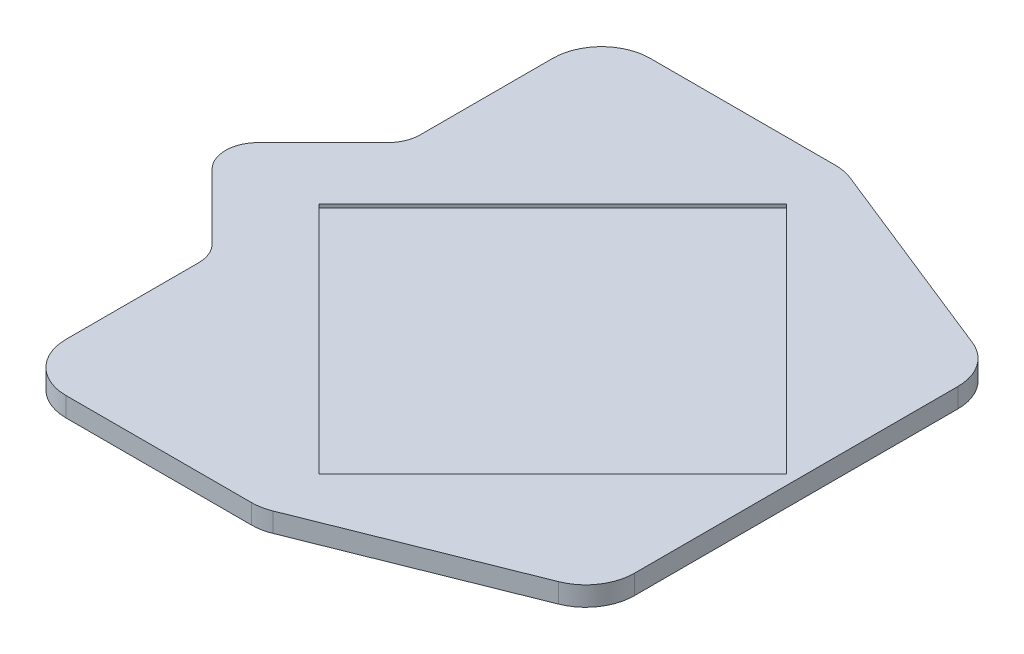
ISO-10303-21;
HEADER;
FILE_DESCRIPTION(('STEP AP214'),'2;1');
FILE_NAME('part.step','',(''),(''),'','','');
FILE_SCHEMA(('AUTOMOTIVE_DESIGN { 1 0 10303 214 1 1 1 1 }'));
ENDSEC;
DATA;
#1=APPLICATION_CONTEXT('core data for automotive mechanical design processes');
#2=APPLICATION_PROTOCOL_DEFINITION('international standard','automotive_design',2000,#1);
#3=PRODUCT_CONTEXT('',#1,'mechanical');
#4=PRODUCT('Part','Part','',(#3));
#5=PRODUCT_RELATED_PRODUCT_CATEGORY('part','',(#4));
#6=PRODUCT_DEFINITION_FORMATION('','',#4);
#7=PRODUCT_DEFINITION_CONTEXT('part definition',#1,'design');
#8=PRODUCT_DEFINITION('design','',#6,#7);
#9=PRODUCT_DEFINITION_SHAPE('','',#8);
#10=(LENGTH_UNIT() NAMED_UNIT(*) SI_UNIT(.MILLI.,.METRE.));
#11=(NAMED_UNIT(*) PLANE_ANGLE_UNIT() SI_UNIT($,.RADIAN.));
#12=(NAMED_UNIT(*) SI_UNIT($,.STERADIAN.) SOLID_ANGLE_UNIT());
#13=UNCERTAINTY_MEASURE_WITH_UNIT(LENGTH_MEASURE(1.E-05),#10,'distance_accuracy_value','');
#14=(GEOMETRIC_REPRESENTATION_CONTEXT(3) GLOBAL_UNCERTAINTY_ASSIGNED_CONTEXT((#13)) GLOBAL_UNIT_ASSIGNED_CONTEXT((#10,
#11,#12)) REPRESENTATION_CONTEXT('',''));
#15=CARTESIAN_POINT('',(0.,0.,0.));
#16=DIRECTION('',(0.,0.,1.));
#17=DIRECTION('',(1.,0.,0.));
#18=AXIS2_PLACEMENT_3D('',#15,#16,#17);
#19=CARTESIAN_POINT('',(3.74561403508772,1.1,3.));
#20=DIRECTION('',(-0.707106781186548,0.,-0.707106781186547));
#21=DIRECTION('',(-0.707106781186547,0.,0.707106781186548));
#22=AXIS2_PLACEMENT_3D('',#19,#20,#21);
#23=PLANE('',#22);
#24=DIRECTION('',(0.707106781186547,0.,-0.707106781186548));
#25=VECTOR('',#24,1.);
#26=CARTESIAN_POINT('',(3.74561403508772,1.1,3.));
#27=LINE('',#26,#25);
#28=CARTESIAN_POINT('',(-6.84017240253918,1.1,13.5857864376269));
#29=VERTEX_POINT('',#28);
#30=CARTESIAN_POINT('',(-2.84017240253919,1.1,9.58578643762691));
#31=VERTEX_POINT('',#30);
#32=EDGE_CURVE('E223',#29,#31,#27,.T.);
#33=ORIENTED_EDGE('',*,*,#32,.T.);
#34=DIRECTION('',(0.,-1.,0.));
#35=VECTOR('',#34,1.);
#36=CARTESIAN_POINT('',(-2.84017240253919,1.1,9.58578643762691));
#37=LINE('',#36,#35);
#38=CARTESIAN_POINT('',(-2.84017240253919,-0.1,9.58578643762691));
#39=VERTEX_POINT('',#38);
#40=EDGE_CURVE('E338',#31,#39,#37,.T.);
#41=ORIENTED_EDGE('',*,*,#40,.T.);
#42=DIRECTION('',(0.707106781186547,0.,-0.707106781186548));
#43=VECTOR('',#42,1.);
#44=CARTESIAN_POINT('',(3.74561403508772,-0.1,3.));
#45=LINE('',#44,#43);
#46=CARTESIAN_POINT('',(-6.84017240253918,-0.1,13.5857864376269));
#47=VERTEX_POINT('',#46);
#48=EDGE_CURVE('E219',#47,#39,#45,.T.);
#49=ORIENTED_EDGE('',*,*,#48,.F.);
#50=DIRECTION('',(0.,-1.,0.));
#51=VECTOR('',#50,1.);
#52=CARTESIAN_POINT('',(-6.84017240253918,1.1,13.5857864376269));
#53=LINE('',#52,#51);
#54=EDGE_CURVE('E272',#47,#29,#53,.F.);
#55=ORIENTED_EDGE('',*,*,#54,.T.);
#56=EDGE_LOOP('',(#33,#41,#49,#55));
#57=FACE_BOUND('',#56,.T.);
#58=ADVANCED_FACE('F36',(#57),#23,.T.);
#59=CARTESIAN_POINT('',(-14.2543859649123,1.1,9.));
#60=DIRECTION('',(-0.707106781186547,0.,0.707106781186547));
#61=DIRECTION('',(0.707106781186548,0.,0.707106781186548));
#62=AXIS2_PLACEMENT_3D('',#59,#60,#61);
#63=PLANE('',#62);
#64=DIRECTION('',(-0.707106781186548,0.,-0.707106781186548));
#65=VECTOR('',#64,1.);
#66=CARTESIAN_POINT('',(-14.2543859649123,-0.1,9.));
#67=LINE('',#66,#65);
#68=CARTESIAN_POINT('',(-2.84017240253918,-0.1,20.4142135623731));
#69=VERTEX_POINT('',#68);
#70=CARTESIAN_POINT('',(-6.84017240253918,-0.1,16.4142135623731));
#71=VERTEX_POINT('',#70);
#72=EDGE_CURVE('E248',#69,#71,#67,.T.);
#73=ORIENTED_EDGE('',*,*,#72,.F.);
#74=DIRECTION('',(0.,-1.,0.));
#75=VECTOR('',#74,1.);
#76=CARTESIAN_POINT('',(-2.84017240253919,1.1,20.4142135623731));
#77=LINE('',#76,#75);
#78=CARTESIAN_POINT('',(-2.84017240253918,1.1,20.4142135623731));
#79=VERTEX_POINT('',#78);
#80=EDGE_CURVE('E336',#69,#79,#77,.F.);
#81=ORIENTED_EDGE('',*,*,#80,.T.);
#82=DIRECTION('',(-0.707106781186548,0.,-0.707106781186548));
#83=VECTOR('',#82,1.);
#84=CARTESIAN_POINT('',(-14.2543859649123,1.1,9.));
#85=LINE('',#84,#83);
#86=CARTESIAN_POINT('',(-6.84017240253918,1.1,16.4142135623731));
#87=VERTEX_POINT('',#86);
#88=EDGE_CURVE('E226',#79,#87,#85,.T.);
#89=ORIENTED_EDGE('',*,*,#88,.T.);
#90=DIRECTION('',(0.,-1.,0.));
#91=VECTOR('',#90,1.);
#92=CARTESIAN_POINT('',(-6.84017240253918,1.1,16.4142135623731));
#93=LINE('',#92,#91);
#94=EDGE_CURVE('E267',#87,#71,#93,.T.);
#95=ORIENTED_EDGE('',*,*,#94,.T.);
#96=EDGE_LOOP('',(#73,#81,#89,#95));
#97=FACE_BOUND('',#96,.T.);
#98=ADVANCED_FACE('F364',(#97),#63,.T.);
#99=CARTESIAN_POINT('',(-2.25438596491228,1.1,-3.));
#100=DIRECTION('',(1.,0.,0.));
#101=DIRECTION('',(0.,0.,-1.));
#102=AXIS2_PLACEMENT_3D('',#99,#100,#101);
#103=PLANE('',#102);
#104=DIRECTION('',(0.,0.,1.));
#105=VECTOR('',#104,1.);
#106=CARTESIAN_POINT('',(-2.25438596491228,1.1,-3.));
#107=LINE('',#106,#105);
#108=CARTESIAN_POINT('',(-2.25438596491228,1.1,21.8284271247462));
#109=VERTEX_POINT('',#108);
#110=CARTESIAN_POINT('',(-2.25438596491228,1.1,30.));
#111=VERTEX_POINT('',#110);
#112=EDGE_CURVE('E229',#109,#111,#107,.T.);
#113=ORIENTED_EDGE('',*,*,#112,.F.);
#114=DIRECTION('',(0.,-1.,0.));
#115=VECTOR('',#114,1.);
#116=CARTESIAN_POINT('',(-2.25438596491228,1.1,21.8284271247462));
#117=LINE('',#116,#115);
#118=CARTESIAN_POINT('',(-2.25438596491228,-0.1,21.8284271247462));
#119=VERTEX_POINT('',#118);
#120=EDGE_CURVE('E333',#109,#119,#117,.T.);
#121=ORIENTED_EDGE('',*,*,#120,.T.);
#122=DIRECTION('',(0.,0.,1.));
#123=VECTOR('',#122,1.);
#124=CARTESIAN_POINT('',(-2.25438596491228,-0.1,-3.));
#125=LINE('',#124,#123);
#126=CARTESIAN_POINT('',(-2.25438596491228,-0.1,30.));
#127=VERTEX_POINT('',#126);
#128=EDGE_CURVE('E250',#119,#127,#125,.T.);
#129=ORIENTED_EDGE('',*,*,#128,.T.);
#130=DIRECTION('',(0.,-1.,0.));
#131=VECTOR('',#130,1.);
#132=CARTESIAN_POINT('',(-2.25438596491228,1.1,30.));
#133=LINE('',#132,#131);
#134=EDGE_CURVE('E312',#127,#111,#133,.F.);
#135=ORIENTED_EDGE('',*,*,#134,.T.);
#136=EDGE_LOOP('',(#113,#121,#129,#135));
#137=FACE_BOUND('',#136,.T.);
#138=ADVANCED_FACE('F355',(#137),#103,.F.);
#139=CARTESIAN_POINT('',(-2.25438596491228,1.1,33.));
#140=DIRECTION('',(0.,0.,-1.));
#141=DIRECTION('',(-1.,0.,0.));
#142=AXIS2_PLACEMENT_3D('',#139,#140,#141);
#143=PLANE('',#142);
#144=DIRECTION('',(1.,0.,0.));
#145=VECTOR('',#144,1.);
#146=CARTESIAN_POINT('',(-2.25438596491228,-0.1,33.));
#147=LINE('',#146,#145);
#148=CARTESIAN_POINT('',(0.745614035087718,-0.1,33.));
#149=VERTEX_POINT('',#148);
#150=CARTESIAN_POINT('',(12.1678668243859,-0.1,33.));
#151=VERTEX_POINT('',#150);
#152=EDGE_CURVE('E252',#149,#151,#147,.T.);
#153=ORIENTED_EDGE('',*,*,#152,.T.);
#154=DIRECTION('',(0.,-1.,0.));
#155=VECTOR('',#154,1.);
#156=CARTESIAN_POINT('',(12.1678668243859,1.1,33.));
#157=LINE('',#156,#155);
#158=CARTESIAN_POINT('',(12.1678668243859,1.1,33.));
#159=VERTEX_POINT('',#158);
#160=EDGE_CURVE('E298',#151,#159,#157,.F.);
#161=ORIENTED_EDGE('',*,*,#160,.T.);
#162=DIRECTION('',(1.,0.,0.));
#163=VECTOR('',#162,1.);
#164=CARTESIAN_POINT('',(-2.25438596491228,1.1,33.));
#165=LINE('',#164,#163);
#166=CARTESIAN_POINT('',(0.745614035087718,1.1,33.));
#167=VERTEX_POINT('',#166);
#168=EDGE_CURVE('E231',#167,#159,#165,.T.);
#169=ORIENTED_EDGE('',*,*,#168,.F.);
#170=DIRECTION('',(0.,-1.,0.));
#171=VECTOR('',#170,1.);
#172=CARTESIAN_POINT('',(0.745614035087718,1.1,33.));
#173=LINE('',#172,#171);
#174=EDGE_CURVE('E295',#167,#149,#173,.T.);
#175=ORIENTED_EDGE('',*,*,#174,.T.);
#176=EDGE_LOOP('',(#153,#161,#169,#175));
#177=FACE_BOUND('',#176,.T.);
#178=ADVANCED_FACE('F424',(#177),#143,.F.);
#179=CARTESIAN_POINT('',(12.2283726557774,1.1,33.2068965517241));
#180=DIRECTION('',(0.371390676354104,0.,0.928476690885259));
#181=DIRECTION('',(0.928476690885259,0.,-0.371390676354104));
#182=AXIS2_PLACEMENT_3D('',#179,#180,#181);
#183=PLANE('',#182);
#184=DIRECTION('',(-0.928476690885259,0.,0.371390676354104));
#185=VECTOR('',#184,1.);
#186=CARTESIAN_POINT('',(12.2283726557774,1.1,33.2068965517241));
#187=LINE('',#186,#185);
#188=CARTESIAN_POINT('',(25.85978606415,1.1,27.7543311883751));
#189=VERTEX_POINT('',#188);
#190=CARTESIAN_POINT('',(13.2820388534483,1.1,32.7854300726558));
#191=VERTEX_POINT('',#190);
#192=EDGE_CURVE('E235',#189,#191,#187,.T.);
#193=ORIENTED_EDGE('',*,*,#192,.T.);
#194=DIRECTION('',(0.,-1.,0.));
#195=VECTOR('',#194,1.);
#196=CARTESIAN_POINT('',(13.2820388534483,-0.1,32.7854300726558));
#197=LINE('',#196,#195);
#198=CARTESIAN_POINT('',(13.2820388534483,-0.1,32.7854300726558));
#199=VERTEX_POINT('',#198);
#200=EDGE_CURVE('E279',#191,#199,#197,.T.);
#201=ORIENTED_EDGE('',*,*,#200,.T.);
#202=DIRECTION('',(-0.928476690885259,0.,0.371390676354104));
#203=VECTOR('',#202,1.);
#204=CARTESIAN_POINT('',(12.2283726557774,-0.1,33.2068965517241));
#205=LINE('',#204,#203);
#206=CARTESIAN_POINT('',(25.85978606415,-0.1,27.7543311883751));
#207=VERTEX_POINT('',#206);
#208=EDGE_CURVE('E255',#207,#199,#205,.T.);
#209=ORIENTED_EDGE('',*,*,#208,.F.);
#210=DIRECTION('',(0.,-1.,0.));
#211=VECTOR('',#210,1.);
#212=CARTESIAN_POINT('',(25.85978606415,1.1,27.7543311883751));
#213=LINE('',#212,#211);
#214=EDGE_CURVE('E277',#207,#189,#213,.F.);
#215=ORIENTED_EDGE('',*,*,#214,.T.);
#216=EDGE_LOOP('',(#193,#201,#209,#215));
#217=FACE_BOUND('',#216,.T.);
#218=ADVANCED_FACE('F415',(#217),#183,.T.);
#219=CARTESIAN_POINT('',(27.7456140350877,1.1,-3.));
#220=DIRECTION('',(1.,0.,0.));
#221=DIRECTION('',(0.,0.,-1.));
#222=AXIS2_PLACEMENT_3D('',#219,#220,#221);
#223=PLANE('',#222);
#224=DIRECTION('',(0.,0.,1.));
#225=VECTOR('',#224,1.);
#226=CARTESIAN_POINT('',(27.7456140350877,1.1,-3.));
#227=LINE('',#226,#225);
#228=CARTESIAN_POINT('',(27.7456140350877,1.1,5.0310988842807));
#229=VERTEX_POINT('',#228);
#230=CARTESIAN_POINT('',(27.7456140350877,1.1,24.9689011157193));
#231=VERTEX_POINT('',#230);
#232=EDGE_CURVE('E238',#229,#231,#227,.T.);
#233=ORIENTED_EDGE('',*,*,#232,.T.);
#234=DIRECTION('',(0.,-1.,0.));
#235=VECTOR('',#234,1.);
#236=CARTESIAN_POINT('',(27.7456140350877,1.1,24.9689011157193));
#237=LINE('',#236,#235);
#238=CARTESIAN_POINT('',(27.7456140350877,-0.1,24.9689011157193));
#239=VERTEX_POINT('',#238);
#240=EDGE_CURVE('E317',#231,#239,#237,.T.);
#241=ORIENTED_EDGE('',*,*,#240,.T.);
#242=DIRECTION('',(0.,0.,1.));
#243=VECTOR('',#242,1.);
#244=CARTESIAN_POINT('',(27.7456140350877,-0.1,-3.));
#245=LINE('',#244,#243);
#246=CARTESIAN_POINT('',(27.7456140350877,-0.1,5.0310988842807));
#247=VERTEX_POINT('',#246);
#248=EDGE_CURVE('E258',#247,#239,#245,.T.);
#249=ORIENTED_EDGE('',*,*,#248,.F.);
#250=DIRECTION('',(0.,-1.,0.));
#251=VECTOR('',#250,1.);
#252=CARTESIAN_POINT('',(27.7456140350877,1.1,5.0310988842807));
#253=LINE('',#252,#251);
#254=EDGE_CURVE('E315',#247,#229,#253,.F.);
#255=ORIENTED_EDGE('',*,*,#254,.T.);
#256=EDGE_LOOP('',(#233,#241,#249,#255));
#257=FACE_BOUND('',#256,.T.);
#258=ADVANCED_FACE('F406',(#257),#223,.T.);
#259=CARTESIAN_POINT('',(-0.185420447670902,1.1,-8.17241379310345));
#260=DIRECTION('',(0.371390676354104,0.,-0.928476690885259));
#261=DIRECTION('',(-0.928476690885259,0.,-0.371390676354104));
#262=AXIS2_PLACEMENT_3D('',#259,#260,#261);
#263=PLANE('',#262);
#264=DIRECTION('',(0.928476690885259,0.,0.371390676354104));
#265=VECTOR('',#264,1.);
#266=CARTESIAN_POINT('',(-0.185420447670902,1.1,-8.17241379310345));
#267=LINE('',#266,#265);
#268=CARTESIAN_POINT('',(13.2820388534483,1.1,-2.78543007265578));
#269=VERTEX_POINT('',#268);
#270=CARTESIAN_POINT('',(25.85978606415,1.1,2.24566881162493));
#271=VERTEX_POINT('',#270);
#272=EDGE_CURVE('E241',#269,#271,#267,.T.);
#273=ORIENTED_EDGE('',*,*,#272,.T.);
#274=DIRECTION('',(0.,-1.,0.));
#275=VECTOR('',#274,1.);
#276=CARTESIAN_POINT('',(25.85978606415,1.1,2.24566881162493));
#277=LINE('',#276,#275);
#278=CARTESIAN_POINT('',(25.85978606415,-0.1,2.24566881162493));
#279=VERTEX_POINT('',#278);
#280=EDGE_CURVE('E322',#271,#279,#277,.T.);
#281=ORIENTED_EDGE('',*,*,#280,.T.);
#282=DIRECTION('',(0.928476690885259,0.,0.371390676354104));
#283=VECTOR('',#282,1.);
#284=CARTESIAN_POINT('',(-0.185420447670902,-0.1,-8.17241379310345));
#285=LINE('',#284,#283);
#286=CARTESIAN_POINT('',(13.2820388534483,-0.1,-2.78543007265578));
#287=VERTEX_POINT('',#286);
#288=EDGE_CURVE('E261',#287,#279,#285,.T.);
#289=ORIENTED_EDGE('',*,*,#288,.F.);
#290=DIRECTION('',(0.,-1.,0.));
#291=VECTOR('',#290,1.);
#292=CARTESIAN_POINT('',(13.2820388534483,1.1,-2.78543007265578));
#293=LINE('',#292,#291);
#294=EDGE_CURVE('E320',#287,#269,#293,.F.);
#295=ORIENTED_EDGE('',*,*,#294,.T.);
#296=EDGE_LOOP('',(#273,#281,#289,#295));
#297=FACE_BOUND('',#296,.T.);
#298=ADVANCED_FACE('F397',(#297),#263,.T.);
#299=CARTESIAN_POINT('',(-2.25438596491228,1.1,-3.));
#300=DIRECTION('',(0.,0.,-1.));
#301=DIRECTION('',(-1.,0.,0.));
#302=AXIS2_PLACEMENT_3D('',#299,#300,#301);
#303=PLANE('',#302);
#304=DIRECTION('',(1.,0.,0.));
#305=VECTOR('',#304,1.);
#306=CARTESIAN_POINT('',(-2.25438596491228,1.1,-3.));
#307=LINE('',#306,#305);
#308=CARTESIAN_POINT('',(0.745614035087718,1.1,-3.));
#309=VERTEX_POINT('',#308);
#310=CARTESIAN_POINT('',(12.167866824386,1.1,-3.));
#311=VERTEX_POINT('',#310);
#312=EDGE_CURVE('E244',#309,#311,#307,.T.);
#313=ORIENTED_EDGE('',*,*,#312,.T.);
#314=DIRECTION('',(0.,-1.,0.));
#315=VECTOR('',#314,1.);
#316=CARTESIAN_POINT('',(12.167866824386,1.1,-3.));
#317=LINE('',#316,#315);
#318=CARTESIAN_POINT('',(12.167866824386,-0.1,-3.));
#319=VERTEX_POINT('',#318);
#320=EDGE_CURVE('E327',#311,#319,#317,.T.);
#321=ORIENTED_EDGE('',*,*,#320,.T.);
#322=DIRECTION('',(1.,0.,0.));
#323=VECTOR('',#322,1.);
#324=CARTESIAN_POINT('',(-2.25438596491228,-0.1,-3.));
#325=LINE('',#324,#323);
#326=CARTESIAN_POINT('',(0.745614035087718,-0.1,-3.));
#327=VERTEX_POINT('',#326);
#328=EDGE_CURVE('E264',#327,#319,#325,.T.);
#329=ORIENTED_EDGE('',*,*,#328,.F.);
#330=DIRECTION('',(0.,-1.,0.));
#331=VECTOR('',#330,1.);
#332=CARTESIAN_POINT('',(0.745614035087718,1.1,-3.));
#333=LINE('',#332,#331);
#334=EDGE_CURVE('E325',#327,#309,#333,.F.);
#335=ORIENTED_EDGE('',*,*,#334,.T.);
#336=EDGE_LOOP('',(#313,#321,#329,#335));
#337=FACE_BOUND('',#336,.T.);
#338=ADVANCED_FACE('F389',(#337),#303,.T.);
#339=CARTESIAN_POINT('',(-2.25438596491228,-0.1,0.));
#340=VERTEX_POINT('',#339);
#341=CARTESIAN_POINT('',(-2.25438596491228,-0.1,8.17157287525381));
#342=VERTEX_POINT('',#341);
#343=EDGE_CURVE('E227',#340,#342,#125,.T.);
#344=ORIENTED_EDGE('',*,*,#343,.T.);
#345=DIRECTION('',(0.,-1.,0.));
#346=VECTOR('',#345,1.);
#347=CARTESIAN_POINT('',(-2.25438596491228,1.1,8.17157287525381));
#348=LINE('',#347,#346);
#349=CARTESIAN_POINT('',(-2.25438596491228,1.1,8.17157287525381));
#350=VERTEX_POINT('',#349);
#351=EDGE_CURVE('E341',#342,#350,#348,.F.);
#352=ORIENTED_EDGE('',*,*,#351,.T.);
#353=CARTESIAN_POINT('',(-2.25438596491228,1.1,0.));
#354=VERTEX_POINT('',#353);
#355=EDGE_CURVE('E232',#354,#350,#107,.T.);
#356=ORIENTED_EDGE('',*,*,#355,.F.);
#357=DIRECTION('',(0.,-1.,0.));
#358=VECTOR('',#357,1.);
#359=CARTESIAN_POINT('',(-2.25438596491228,-0.1,0.));
#360=LINE('',#359,#358);
#361=EDGE_CURVE('E330',#354,#340,#360,.T.);
#362=ORIENTED_EDGE('',*,*,#361,.T.);
#363=EDGE_LOOP('',(#344,#352,#356,#362));
#364=FACE_BOUND('',#363,.T.);
#365=ADVANCED_FACE('F380',(#364),#103,.F.);
#366=CARTESIAN_POINT('',(-2.25438596491228,1.1,-3.));
#367=DIRECTION('',(0.,1.,0.));
#368=DIRECTION('',(0.,0.,1.));
#369=AXIS2_PLACEMENT_3D('',#366,#367,#368);
#370=PLANE('',#369);
#371=DIRECTION('',(0.707106781186547,0.,-0.707106781186548));
#372=VECTOR('',#371,1.);
#373=CARTESIAN_POINT('',(12.7351893878508,1.1,29.4108362005818));
#374=LINE('',#373,#372);
#375=CARTESIAN_POINT('',(12.7351893878508,1.1,29.4108362005818));
#376=VERTEX_POINT('',#375);
#377=CARTESIAN_POINT('',(27.1460255884326,1.1,15.));
#378=VERTEX_POINT('',#377);
#379=EDGE_CURVE('E51',#376,#378,#374,.T.);
#380=ORIENTED_EDGE('',*,*,#379,.F.);
#381=DIRECTION('',(0.707106781186548,0.,0.707106781186547));
#382=VECTOR('',#381,1.);
#383=CARTESIAN_POINT('',(-1.67564681273105,1.1,15.));
#384=LINE('',#383,#382);
#385=CARTESIAN_POINT('',(-1.67564681273105,1.1,15.));
#386=VERTEX_POINT('',#385);
#387=EDGE_CURVE('E204',#386,#376,#384,.T.);
#388=ORIENTED_EDGE('',*,*,#387,.F.);
#389=DIRECTION('',(-0.707106781186547,0.,0.707106781186548));
#390=VECTOR('',#389,1.);
#391=CARTESIAN_POINT('',(12.7351893878508,1.1,0.589163799418154));
#392=LINE('',#391,#390);
#393=CARTESIAN_POINT('',(12.7351893878508,1.1,0.589163799418154));
#394=VERTEX_POINT('',#393);
#395=EDGE_CURVE('E207',#394,#386,#392,.T.);
#396=ORIENTED_EDGE('',*,*,#395,.F.);
#397=DIRECTION('',(-0.707106781186548,0.,-0.707106781186548));
#398=VECTOR('',#397,1.);
#399=CARTESIAN_POINT('',(27.1460255884326,1.1,15.));
#400=LINE('',#399,#398);
#401=EDGE_CURVE('E213',#378,#394,#400,.T.);
#402=ORIENTED_EDGE('',*,*,#401,.F.);
#403=EDGE_LOOP('',(#380,#388,#396,#402));
#404=FACE_BOUND('',#403,.T.);
#405=ORIENTED_EDGE('',*,*,#168,.T.);
#406=CARTESIAN_POINT('',(12.1678668243859,1.1,30.));
#407=DIRECTION('',(0.,1.,0.));
#408=DIRECTION('',(0.,0.,1.));
#409=AXIS2_PLACEMENT_3D('',#406,#407,#408);
#410=CIRCLE('',#409,3.);
#411=EDGE_CURVE('E310',#159,#191,#410,.T.);
#412=ORIENTED_EDGE('',*,*,#411,.T.);
#413=ORIENTED_EDGE('',*,*,#192,.F.);
#414=CARTESIAN_POINT('',(24.7456140350877,1.1,24.9689011157193));
#415=DIRECTION('',(0.,1.,0.));
#416=DIRECTION('',(0.,0.,1.));
#417=AXIS2_PLACEMENT_3D('',#414,#415,#416);
#418=CIRCLE('',#417,3.);
#419=EDGE_CURVE('E306',#189,#231,#418,.T.);
#420=ORIENTED_EDGE('',*,*,#419,.T.);
#421=ORIENTED_EDGE('',*,*,#232,.F.);
#422=CARTESIAN_POINT('',(24.7456140350877,1.1,5.0310988842807));
#423=DIRECTION('',(0.,1.,0.));
#424=DIRECTION('',(0.,0.,1.));
#425=AXIS2_PLACEMENT_3D('',#422,#423,#424);
#426=CIRCLE('',#425,3.);
#427=EDGE_CURVE('E304',#229,#271,#426,.T.);
#428=ORIENTED_EDGE('',*,*,#427,.T.);
#429=ORIENTED_EDGE('',*,*,#272,.F.);
#430=CARTESIAN_POINT('',(12.167866824386,1.1,0.));
#431=DIRECTION('',(0.,1.,0.));
#432=DIRECTION('',(0.,0.,1.));
#433=AXIS2_PLACEMENT_3D('',#430,#431,#432);
#434=CIRCLE('',#433,3.);
#435=EDGE_CURVE('E302',#269,#311,#434,.T.);
#436=ORIENTED_EDGE('',*,*,#435,.T.);
#437=ORIENTED_EDGE('',*,*,#312,.F.);
#438=CARTESIAN_POINT('',(0.745614035087718,1.1,0.));
#439=DIRECTION('',(0.,1.,0.));
#440=DIRECTION('',(0.,0.,1.));
#441=AXIS2_PLACEMENT_3D('',#438,#439,#440);
#442=CIRCLE('',#441,3.);
#443=EDGE_CURVE('E300',#309,#354,#442,.T.);
#444=ORIENTED_EDGE('',*,*,#443,.T.);
#445=ORIENTED_EDGE('',*,*,#355,.T.);
#446=CARTESIAN_POINT('',(-4.25438596491228,1.1,8.17157287525381));
#447=DIRECTION('',(0.,1.,0.));
#448=DIRECTION('',(0.,0.,1.));
#449=AXIS2_PLACEMENT_3D('',#446,#447,#448);
#450=CIRCLE('',#449,2.);
#451=EDGE_CURVE('E11',#350,#31,#450,.F.);
#452=ORIENTED_EDGE('',*,*,#451,.T.);
#453=ORIENTED_EDGE('',*,*,#32,.F.);
#454=CARTESIAN_POINT('',(-5.42595884016609,1.1,15.));
#455=DIRECTION('',(0.,1.,0.));
#456=DIRECTION('',(0.,0.,1.));
#457=AXIS2_PLACEMENT_3D('',#454,#455,#456);
#458=CIRCLE('',#457,2.);
#459=EDGE_CURVE('E274',#29,#87,#458,.T.);
#460=ORIENTED_EDGE('',*,*,#459,.T.);
#461=ORIENTED_EDGE('',*,*,#88,.F.);
#462=CARTESIAN_POINT('',(-4.25438596491228,1.1,21.8284271247462));
#463=DIRECTION('',(0.,1.,0.));
#464=DIRECTION('',(0.,0.,1.));
#465=AXIS2_PLACEMENT_3D('',#462,#463,#464);
#466=CIRCLE('',#465,2.);
#467=EDGE_CURVE('E345',#79,#109,#466,.F.);
#468=ORIENTED_EDGE('',*,*,#467,.T.);
#469=ORIENTED_EDGE('',*,*,#112,.T.);
#470=CARTESIAN_POINT('',(0.745614035087718,1.1,30.));
#471=DIRECTION('',(0.,1.,0.));
#472=DIRECTION('',(0.,0.,1.));
#473=AXIS2_PLACEMENT_3D('',#470,#471,#472);
#474=CIRCLE('',#473,3.);
#475=EDGE_CURVE('E308',#111,#167,#474,.T.);
#476=ORIENTED_EDGE('',*,*,#475,.T.);
#477=EDGE_LOOP('',(#405,#412,#413,#420,#421,#428,#429,#436,#437,#444,#445,#452,#453,#460,#461,
#468,#469,#476));
#478=FACE_BOUND('',#477,.T.);
#479=ADVANCED_FACE('F350',(#404,#478),#370,.T.);
#480=CARTESIAN_POINT('',(-2.25438596491228,-0.1,-3.));
#481=DIRECTION('',(0.,1.,0.));
#482=DIRECTION('',(0.,0.,1.));
#483=AXIS2_PLACEMENT_3D('',#480,#481,#482);
#484=PLANE('',#483);
#485=ORIENTED_EDGE('',*,*,#208,.T.);
#486=CARTESIAN_POINT('',(12.1678668243859,-0.1,30.));
#487=DIRECTION('',(0.,1.,0.));
#488=DIRECTION('',(0.,0.,1.));
#489=AXIS2_PLACEMENT_3D('',#486,#487,#488);
#490=CIRCLE('',#489,3.);
#491=EDGE_CURVE('E293',#199,#151,#490,.F.);
#492=ORIENTED_EDGE('',*,*,#491,.T.);
#493=ORIENTED_EDGE('',*,*,#152,.F.);
#494=CARTESIAN_POINT('',(0.745614035087718,-0.1,30.));
#495=DIRECTION('',(0.,1.,0.));
#496=DIRECTION('',(0.,0.,1.));
#497=AXIS2_PLACEMENT_3D('',#494,#495,#496);
#498=CIRCLE('',#497,3.);
#499=EDGE_CURVE('E290',#149,#127,#498,.F.);
#500=ORIENTED_EDGE('',*,*,#499,.T.);
#501=ORIENTED_EDGE('',*,*,#128,.F.);
#502=CARTESIAN_POINT('',(-4.25438596491228,-0.1,21.8284271247462));
#503=DIRECTION('',(0.,1.,0.));
#504=DIRECTION('',(0.,0.,1.));
#505=AXIS2_PLACEMENT_3D('',#502,#503,#504);
#506=CIRCLE('',#505,2.);
#507=EDGE_CURVE('E343',#119,#69,#506,.T.);
#508=ORIENTED_EDGE('',*,*,#507,.T.);
#509=ORIENTED_EDGE('',*,*,#72,.T.);
#510=CARTESIAN_POINT('',(-5.42595884016609,-0.1,15.));
#511=DIRECTION('',(0.,1.,0.));
#512=DIRECTION('',(0.,0.,1.));
#513=AXIS2_PLACEMENT_3D('',#510,#511,#512);
#514=CIRCLE('',#513,2.);
#515=EDGE_CURVE('E270',#71,#47,#514,.F.);
#516=ORIENTED_EDGE('',*,*,#515,.T.);
#517=ORIENTED_EDGE('',*,*,#48,.T.);
#518=CARTESIAN_POINT('',(-4.25438596491228,-0.1,8.17157287525381));
#519=DIRECTION('',(0.,1.,0.));
#520=DIRECTION('',(0.,0.,1.));
#521=AXIS2_PLACEMENT_3D('',#518,#519,#520);
#522=CIRCLE('',#521,2.);
#523=EDGE_CURVE('E44',#39,#342,#522,.T.);
#524=ORIENTED_EDGE('',*,*,#523,.T.);
#525=ORIENTED_EDGE('',*,*,#343,.F.);
#526=CARTESIAN_POINT('',(0.745614035087718,-0.1,0.));
#527=DIRECTION('',(0.,1.,0.));
#528=DIRECTION('',(0.,0.,1.));
#529=AXIS2_PLACEMENT_3D('',#526,#527,#528);
#530=CIRCLE('',#529,3.);
#531=EDGE_CURVE('E282',#340,#327,#530,.F.);
#532=ORIENTED_EDGE('',*,*,#531,.T.);
#533=ORIENTED_EDGE('',*,*,#328,.T.);
#534=CARTESIAN_POINT('',(12.167866824386,-0.1,0.));
#535=DIRECTION('',(0.,1.,0.));
#536=DIRECTION('',(0.,0.,1.));
#537=AXIS2_PLACEMENT_3D('',#534,#535,#536);
#538=CIRCLE('',#537,3.);
#539=EDGE_CURVE('E284',#319,#287,#538,.F.);
#540=ORIENTED_EDGE('',*,*,#539,.T.);
#541=ORIENTED_EDGE('',*,*,#288,.T.);
#542=CARTESIAN_POINT('',(24.7456140350877,-0.1,5.0310988842807));
#543=DIRECTION('',(0.,1.,0.));
#544=DIRECTION('',(0.,0.,1.));
#545=AXIS2_PLACEMENT_3D('',#542,#543,#544);
#546=CIRCLE('',#545,3.);
#547=EDGE_CURVE('E286',#279,#247,#546,.F.);
#548=ORIENTED_EDGE('',*,*,#547,.T.);
#549=ORIENTED_EDGE('',*,*,#248,.T.);
#550=CARTESIAN_POINT('',(24.7456140350877,-0.1,24.9689011157193));
#551=DIRECTION('',(0.,1.,0.));
#552=DIRECTION('',(0.,0.,1.));
#553=AXIS2_PLACEMENT_3D('',#550,#551,#552);
#554=CIRCLE('',#553,3.);
#555=EDGE_CURVE('E288',#239,#207,#554,.F.);
#556=ORIENTED_EDGE('',*,*,#555,.T.);
#557=EDGE_LOOP('',(#485,#492,#493,#500,#501,#508,#509,#516,#517,#524,#525,#532,#533,#540,#541,
#548,#549,#556));
#558=FACE_BOUND('',#557,.T.);
#559=ADVANCED_FACE('F361',(#558),#484,.F.);
#560=CARTESIAN_POINT('',(-5.42595884016609,1.1,15.));
#561=DIRECTION('',(0.,-1.,0.));
#562=DIRECTION('',(0.,0.,-1.));
#563=AXIS2_PLACEMENT_3D('',#560,#561,#562);
#564=CYLINDRICAL_SURFACE('',#563,2.);
#565=ORIENTED_EDGE('',*,*,#459,.F.);
#566=ORIENTED_EDGE('',*,*,#54,.F.);
#567=ORIENTED_EDGE('',*,*,#515,.F.);
#568=ORIENTED_EDGE('',*,*,#94,.F.);
#569=EDGE_LOOP('',(#565,#566,#567,#568));
#570=FACE_BOUND('',#569,.T.);
#571=ADVANCED_FACE('F368',(#570),#564,.T.);
#572=CARTESIAN_POINT('',(12.1678668243859,1.1,30.));
#573=DIRECTION('',(0.,1.,0.));
#574=DIRECTION('',(0.,0.,1.));
#575=AXIS2_PLACEMENT_3D('',#572,#573,#574);
#576=CYLINDRICAL_SURFACE('',#575,3.);
#577=ORIENTED_EDGE('',*,*,#411,.F.);
#578=ORIENTED_EDGE('',*,*,#160,.F.);
#579=ORIENTED_EDGE('',*,*,#491,.F.);
#580=ORIENTED_EDGE('',*,*,#200,.F.);
#581=EDGE_LOOP('',(#577,#578,#579,#580));
#582=FACE_BOUND('',#581,.T.);
#583=ADVANCED_FACE('F420',(#582),#576,.T.);
#584=CARTESIAN_POINT('',(0.745614035087718,1.1,30.));
#585=DIRECTION('',(0.,-1.,0.));
#586=DIRECTION('',(0.,0.,-1.));
#587=AXIS2_PLACEMENT_3D('',#584,#585,#586);
#588=CYLINDRICAL_SURFACE('',#587,3.);
#589=ORIENTED_EDGE('',*,*,#475,.F.);
#590=ORIENTED_EDGE('',*,*,#134,.F.);
#591=ORIENTED_EDGE('',*,*,#499,.F.);
#592=ORIENTED_EDGE('',*,*,#174,.F.);
#593=EDGE_LOOP('',(#589,#590,#591,#592));
#594=FACE_BOUND('',#593,.T.);
#595=ADVANCED_FACE('F428',(#594),#588,.T.);
#596=CARTESIAN_POINT('',(24.7456140350877,1.1,24.9689011157193));
#597=DIRECTION('',(0.,-1.,0.));
#598=DIRECTION('',(0.,0.,-1.));
#599=AXIS2_PLACEMENT_3D('',#596,#597,#598);
#600=CYLINDRICAL_SURFACE('',#599,3.);
#601=ORIENTED_EDGE('',*,*,#419,.F.);
#602=ORIENTED_EDGE('',*,*,#214,.F.);
#603=ORIENTED_EDGE('',*,*,#555,.F.);
#604=ORIENTED_EDGE('',*,*,#240,.F.);
#605=EDGE_LOOP('',(#601,#602,#603,#604));
#606=FACE_BOUND('',#605,.T.);
#607=ADVANCED_FACE('F411',(#606),#600,.T.);
#608=CARTESIAN_POINT('',(24.7456140350877,1.1,5.0310988842807));
#609=DIRECTION('',(0.,-1.,0.));
#610=DIRECTION('',(0.,0.,-1.));
#611=AXIS2_PLACEMENT_3D('',#608,#609,#610);
#612=CYLINDRICAL_SURFACE('',#611,3.);
#613=ORIENTED_EDGE('',*,*,#427,.F.);
#614=ORIENTED_EDGE('',*,*,#254,.F.);
#615=ORIENTED_EDGE('',*,*,#547,.F.);
#616=ORIENTED_EDGE('',*,*,#280,.F.);
#617=EDGE_LOOP('',(#613,#614,#615,#616));
#618=FACE_BOUND('',#617,.T.);
#619=ADVANCED_FACE('F402',(#618),#612,.T.);
#620=CARTESIAN_POINT('',(12.167866824386,1.1,0.));
#621=DIRECTION('',(0.,-1.,0.));
#622=DIRECTION('',(0.,0.,-1.));
#623=AXIS2_PLACEMENT_3D('',#620,#621,#622);
#624=CYLINDRICAL_SURFACE('',#623,3.);
#625=ORIENTED_EDGE('',*,*,#435,.F.);
#626=ORIENTED_EDGE('',*,*,#294,.F.);
#627=ORIENTED_EDGE('',*,*,#539,.F.);
#628=ORIENTED_EDGE('',*,*,#320,.F.);
#629=EDGE_LOOP('',(#625,#626,#627,#628));
#630=FACE_BOUND('',#629,.T.);
#631=ADVANCED_FACE('F393',(#630),#624,.T.);
#632=CARTESIAN_POINT('',(0.745614035087718,1.1,0.));
#633=DIRECTION('',(0.,1.,0.));
#634=DIRECTION('',(0.,0.,1.));
#635=AXIS2_PLACEMENT_3D('',#632,#633,#634);
#636=CYLINDRICAL_SURFACE('',#635,3.);
#637=ORIENTED_EDGE('',*,*,#443,.F.);
#638=ORIENTED_EDGE('',*,*,#334,.F.);
#639=ORIENTED_EDGE('',*,*,#531,.F.);
#640=ORIENTED_EDGE('',*,*,#361,.F.);
#641=EDGE_LOOP('',(#637,#638,#639,#640));
#642=FACE_BOUND('',#641,.T.);
#643=ADVANCED_FACE('F386',(#642),#636,.T.);
#644=CARTESIAN_POINT('',(-4.25438596491228,1.1,21.8284271247462));
#645=DIRECTION('',(0.,-1.,0.));
#646=DIRECTION('',(0.,0.,-1.));
#647=AXIS2_PLACEMENT_3D('',#644,#645,#646);
#648=CYLINDRICAL_SURFACE('',#647,2.);
#649=ORIENTED_EDGE('',*,*,#467,.F.);
#650=ORIENTED_EDGE('',*,*,#80,.F.);
#651=ORIENTED_EDGE('',*,*,#507,.F.);
#652=ORIENTED_EDGE('',*,*,#120,.F.);
#653=EDGE_LOOP('',(#649,#650,#651,#652));
#654=FACE_BOUND('',#653,.T.);
#655=ADVANCED_FACE('F359',(#654),#648,.F.);
#656=CARTESIAN_POINT('',(-4.25438596491228,1.1,8.17157287525381));
#657=DIRECTION('',(0.,-1.,0.));
#658=DIRECTION('',(0.,0.,-1.));
#659=AXIS2_PLACEMENT_3D('',#656,#657,#658);
#660=CYLINDRICAL_SURFACE('',#659,2.);
#661=ORIENTED_EDGE('',*,*,#451,.F.);
#662=ORIENTED_EDGE('',*,*,#351,.F.);
#663=ORIENTED_EDGE('',*,*,#523,.F.);
#664=ORIENTED_EDGE('',*,*,#40,.F.);
#665=EDGE_LOOP('',(#661,#662,#663,#664));
#666=FACE_BOUND('',#665,.T.);
#667=ADVANCED_FACE('F38',(#666),#660,.F.);
#668=CARTESIAN_POINT('',(12.7351893878508,0.9,29.4108362005818));
#669=DIRECTION('',(0.707106781186548,0.,0.707106781186547));
#670=DIRECTION('',(0.707106781186547,0.,-0.707106781186548));
#671=AXIS2_PLACEMENT_3D('',#668,#669,#670);
#672=PLANE('',#671);
#673=ORIENTED_EDGE('',*,*,#379,.T.);
#674=DIRECTION('',(0.,1.,0.));
#675=VECTOR('',#674,1.);
#676=CARTESIAN_POINT('',(27.1460255884326,0.9,15.));
#677=LINE('',#676,#675);
#678=CARTESIAN_POINT('',(27.1460255884326,0.9,15.));
#679=VERTEX_POINT('',#678);
#680=EDGE_CURVE('E182',#679,#378,#677,.T.);
#681=ORIENTED_EDGE('',*,*,#680,.F.);
#682=DIRECTION('',(0.707106781186547,0.,-0.707106781186548));
#683=VECTOR('',#682,1.);
#684=CARTESIAN_POINT('',(12.7351893878508,0.9,29.4108362005818));
#685=LINE('',#684,#683);
#686=CARTESIAN_POINT('',(12.7351893878508,0.9,29.4108362005818));
#687=VERTEX_POINT('',#686);
#688=EDGE_CURVE('E186',#687,#679,#685,.T.);
#689=ORIENTED_EDGE('',*,*,#688,.F.);
#690=DIRECTION('',(0.,1.,0.));
#691=VECTOR('',#690,1.);
#692=CARTESIAN_POINT('',(12.7351893878508,0.9,29.4108362005818));
#693=LINE('',#692,#691);
#694=EDGE_CURVE('E217',#687,#376,#693,.T.);
#695=ORIENTED_EDGE('',*,*,#694,.T.);
#696=EDGE_LOOP('',(#673,#681,#689,#695));
#697=FACE_BOUND('',#696,.T.);
#698=ADVANCED_FACE('F184',(#697),#672,.F.);
#699=CARTESIAN_POINT('',(-1.67564681273105,0.9,15.));
#700=DIRECTION('',(-0.707106781186548,0.,0.707106781186548));
#701=DIRECTION('',(0.707106781186548,0.,0.707106781186547));
#702=AXIS2_PLACEMENT_3D('',#699,#700,#701);
#703=PLANE('',#702);
#704=ORIENTED_EDGE('',*,*,#387,.T.);
#705=ORIENTED_EDGE('',*,*,#694,.F.);
#706=DIRECTION('',(0.707106781186548,0.,0.707106781186547));
#707=VECTOR('',#706,1.);
#708=CARTESIAN_POINT('',(-1.67564681273105,0.9,15.));
#709=LINE('',#708,#707);
#710=CARTESIAN_POINT('',(-1.67564681273105,0.9,15.));
#711=VERTEX_POINT('',#710);
#712=EDGE_CURVE('E192',#711,#687,#709,.T.);
#713=ORIENTED_EDGE('',*,*,#712,.F.);
#714=DIRECTION('',(0.,1.,0.));
#715=VECTOR('',#714,1.);
#716=CARTESIAN_POINT('',(-1.67564681273105,0.9,15.));
#717=LINE('',#716,#715);
#718=EDGE_CURVE('E220',#711,#386,#717,.T.);
#719=ORIENTED_EDGE('',*,*,#718,.T.);
#720=EDGE_LOOP('',(#704,#705,#713,#719));
#721=FACE_BOUND('',#720,.T.);
#722=ADVANCED_FACE('F597',(#721),#703,.F.);
#723=CARTESIAN_POINT('',(12.7351893878508,0.9,0.589163799418154));
#724=DIRECTION('',(-0.707106781186548,0.,-0.707106781186548));
#725=DIRECTION('',(-0.707106781186547,0.,0.707106781186548));
#726=AXIS2_PLACEMENT_3D('',#723,#724,#725);
#727=PLANE('',#726);
#728=ORIENTED_EDGE('',*,*,#395,.T.);
#729=ORIENTED_EDGE('',*,*,#718,.F.);
#730=DIRECTION('',(-0.707106781186547,0.,0.707106781186548));
#731=VECTOR('',#730,1.);
#732=CARTESIAN_POINT('',(12.7351893878508,0.9,0.589163799418154));
#733=LINE('',#732,#731);
#734=CARTESIAN_POINT('',(12.7351893878508,0.9,0.589163799418154));
#735=VERTEX_POINT('',#734);
#736=EDGE_CURVE('E200',#735,#711,#733,.T.);
#737=ORIENTED_EDGE('',*,*,#736,.F.);
#738=DIRECTION('',(0.,1.,0.));
#739=VECTOR('',#738,1.);
#740=CARTESIAN_POINT('',(12.7351893878508,0.9,0.589163799418154));
#741=LINE('',#740,#739);
#742=EDGE_CURVE('E191',#735,#394,#741,.T.);
#743=ORIENTED_EDGE('',*,*,#742,.T.);
#744=EDGE_LOOP('',(#728,#729,#737,#743));
#745=FACE_BOUND('',#744,.T.);
#746=ADVANCED_FACE('F605',(#745),#727,.F.);
#747=CARTESIAN_POINT('',(27.1460255884326,0.9,15.));
#748=DIRECTION('',(0.707106781186548,0.,-0.707106781186548));
#749=DIRECTION('',(-0.707106781186548,0.,-0.707106781186548));
#750=AXIS2_PLACEMENT_3D('',#747,#748,#749);
#751=PLANE('',#750);
#752=ORIENTED_EDGE('',*,*,#401,.T.);
#753=ORIENTED_EDGE('',*,*,#742,.F.);
#754=DIRECTION('',(-0.707106781186548,0.,-0.707106781186548));
#755=VECTOR('',#754,1.);
#756=CARTESIAN_POINT('',(27.1460255884326,0.9,15.));
#757=LINE('',#756,#755);
#758=EDGE_CURVE('E195',#679,#735,#757,.T.);
#759=ORIENTED_EDGE('',*,*,#758,.F.);
#760=ORIENTED_EDGE('',*,*,#680,.T.);
#761=EDGE_LOOP('',(#752,#753,#759,#760));
#762=FACE_BOUND('',#761,.T.);
#763=ADVANCED_FACE('F196',(#762),#751,.F.);
#764=CARTESIAN_POINT('',(0.,0.9,0.));
#765=DIRECTION('',(0.,1.,0.));
#766=DIRECTION('',(0.,0.,1.));
#767=AXIS2_PLACEMENT_3D('',#764,#765,#766);
#768=PLANE('',#767);
#769=ORIENTED_EDGE('',*,*,#688,.T.);
#770=ORIENTED_EDGE('',*,*,#758,.T.);
#771=ORIENTED_EDGE('',*,*,#736,.T.);
#772=ORIENTED_EDGE('',*,*,#712,.T.);
#773=EDGE_LOOP('',(#769,#770,#771,#772));
#774=FACE_BOUND('',#773,.T.);
#775=ADVANCED_FACE('F202',(#774),#768,.T.);
#776=CLOSED_SHELL('',(#58,#98,#138,#178,#218,#258,#298,#338,#365,#479,#559,#571,#583,#595,#607,
#619,#631,#643,#655,#667,#698,#722,#746,#763,#775));
#777=MANIFOLD_SOLID_BREP('B2',#776);
#778=ADVANCED_BREP_SHAPE_REPRESENTATION('',(#18,#777),#14);
#779=SHAPE_DEFINITION_REPRESENTATION(#9,#778);
ENDSEC;
END-ISO-10303-21;
